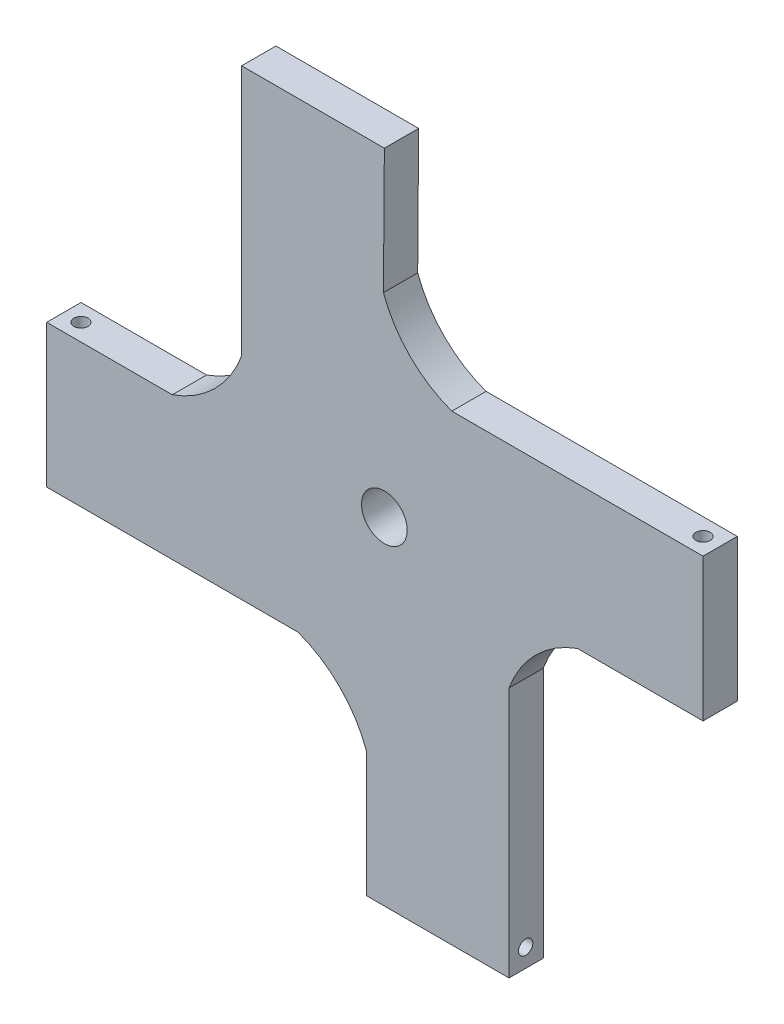
ISO-10303-21;
HEADER;
FILE_DESCRIPTION(('STEP AP214'),'2;1');
FILE_NAME('part.step','',(''),(''),'','','');
FILE_SCHEMA(('AUTOMOTIVE_DESIGN { 1 0 10303 214 1 1 1 1 }'));
ENDSEC;
DATA;
#1=APPLICATION_CONTEXT('core data for automotive mechanical design processes');
#2=APPLICATION_PROTOCOL_DEFINITION('international standard','automotive_design',2000,#1);
#3=PRODUCT_CONTEXT('',#1,'mechanical');
#4=PRODUCT('Part','Part','',(#3));
#5=PRODUCT_RELATED_PRODUCT_CATEGORY('part','',(#4));
#6=PRODUCT_DEFINITION_FORMATION('','',#4);
#7=PRODUCT_DEFINITION_CONTEXT('part definition',#1,'design');
#8=PRODUCT_DEFINITION('design','',#6,#7);
#9=PRODUCT_DEFINITION_SHAPE('','',#8);
#10=(LENGTH_UNIT() NAMED_UNIT(*) SI_UNIT(.MILLI.,.METRE.));
#11=(NAMED_UNIT(*) PLANE_ANGLE_UNIT() SI_UNIT($,.RADIAN.));
#12=(NAMED_UNIT(*) SI_UNIT($,.STERADIAN.) SOLID_ANGLE_UNIT());
#13=UNCERTAINTY_MEASURE_WITH_UNIT(LENGTH_MEASURE(1.E-05),#10,'distance_accuracy_value','');
#14=(GEOMETRIC_REPRESENTATION_CONTEXT(3) GLOBAL_UNCERTAINTY_ASSIGNED_CONTEXT((#13)) GLOBAL_UNIT_ASSIGNED_CONTEXT((#10,
#11,#12)) REPRESENTATION_CONTEXT('',''));
#15=CARTESIAN_POINT('',(0.,0.,0.));
#16=DIRECTION('',(0.,0.,1.));
#17=DIRECTION('',(1.,0.,0.));
#18=AXIS2_PLACEMENT_3D('',#15,#16,#17);
#19=CARTESIAN_POINT('',(-87.1613423245683,-13.7341731289876,6.));
#20=DIRECTION('',(0.,0.,-1.));
#21=DIRECTION('',(-1.,0.,0.));
#22=AXIS2_PLACEMENT_3D('',#19,#20,#21);
#23=CYLINDRICAL_SURFACE('',#22,20.);
#24=CARTESIAN_POINT('',(-87.1613423245683,-13.7341731289876,0.));
#25=DIRECTION('',(0.,0.,1.));
#26=DIRECTION('',(1.,0.,0.));
#27=AXIS2_PLACEMENT_3D('',#24,#25,#26);
#28=CIRCLE('',#27,20.);
#29=CARTESIAN_POINT('',(-80.5252849781846,-32.6011480559733,0.));
#30=VERTEX_POINT('',#29);
#31=CARTESIAN_POINT('',(-68.3848244538631,-20.6220157993082,0.));
#32=VERTEX_POINT('',#31);
#33=EDGE_CURVE('E179',#30,#32,#28,.T.);
#34=ORIENTED_EDGE('',*,*,#33,.F.);
#35=DIRECTION('',(0.,0.,-1.));
#36=VECTOR('',#35,1.);
#37=CARTESIAN_POINT('',(-80.5252849781846,-32.6011480559733,6.));
#38=LINE('',#37,#36);
#39=CARTESIAN_POINT('',(-80.5252849781846,-32.6011480559733,6.));
#40=VERTEX_POINT('',#39);
#41=EDGE_CURVE('E11',#40,#30,#38,.T.);
#42=ORIENTED_EDGE('',*,*,#41,.F.);
#43=CARTESIAN_POINT('',(-87.1613423245683,-13.7341731289876,6.));
#44=DIRECTION('',(0.,0.,1.));
#45=DIRECTION('',(1.,0.,0.));
#46=AXIS2_PLACEMENT_3D('',#43,#44,#45);
#47=CIRCLE('',#46,20.);
#48=CARTESIAN_POINT('',(-68.3848244538631,-20.6220157993082,6.));
#49=VERTEX_POINT('',#48);
#50=EDGE_CURVE('E223',#40,#49,#47,.T.);
#51=ORIENTED_EDGE('',*,*,#50,.T.);
#52=DIRECTION('',(0.,0.,-1.));
#53=VECTOR('',#52,1.);
#54=CARTESIAN_POINT('',(-68.3848244538631,-20.6220157993082,6.));
#55=LINE('',#54,#53);
#56=EDGE_CURVE('E109',#49,#32,#55,.T.);
#57=ORIENTED_EDGE('',*,*,#56,.T.);
#58=EDGE_LOOP('',(#34,#42,#51,#57));
#59=FACE_BOUND('',#58,.T.);
#60=ADVANCED_FACE('F35',(#59),#23,.F.);
#61=CARTESIAN_POINT('',(0.,-32.6011480559733,6.));
#62=DIRECTION('',(0.,1.,0.));
#63=DIRECTION('',(0.,0.,1.));
#64=AXIS2_PLACEMENT_3D('',#61,#62,#63);
#65=PLANE('',#64);
#66=CARTESIAN_POINT('',(-99.5252849781846,-32.6011480559733,3.));
#67=DIRECTION('',(0.,1.,0.));
#68=DIRECTION('',(0.,0.,1.));
#69=AXIS2_PLACEMENT_3D('',#66,#67,#68);
#70=CIRCLE('',#69,1.25);
#71=CARTESIAN_POINT('',(-99.5252849781846,-32.6011480559733,4.25));
#72=VERTEX_POINT('',#71);
#73=EDGE_CURVE('E319',#72,#72,#70,.T.);
#74=ORIENTED_EDGE('',*,*,#73,.F.);
#75=EDGE_LOOP('',(#74));
#76=FACE_BOUND('',#75,.T.);
#77=DIRECTION('',(1.,0.,0.));
#78=VECTOR('',#77,1.);
#79=CARTESIAN_POINT('',(0.,-32.6011480559733,0.));
#80=LINE('',#79,#78);
#81=CARTESIAN_POINT('',(-102.525284978185,-32.6011480559733,0.));
#82=VERTEX_POINT('',#81);
#83=EDGE_CURVE('E182',#82,#30,#80,.T.);
#84=ORIENTED_EDGE('',*,*,#83,.F.);
#85=DIRECTION('',(0.,0.,-1.));
#86=VECTOR('',#85,1.);
#87=CARTESIAN_POINT('',(-102.525284978185,-32.6011480559733,6.));
#88=LINE('',#87,#86);
#89=CARTESIAN_POINT('',(-102.525284978185,-32.6011480559733,6.));
#90=VERTEX_POINT('',#89);
#91=EDGE_CURVE('E43',#90,#82,#88,.T.);
#92=ORIENTED_EDGE('',*,*,#91,.F.);
#93=DIRECTION('',(1.,0.,0.));
#94=VECTOR('',#93,1.);
#95=CARTESIAN_POINT('',(0.,-32.6011480559733,6.));
#96=LINE('',#95,#94);
#97=EDGE_CURVE('E309',#90,#40,#96,.T.);
#98=ORIENTED_EDGE('',*,*,#97,.T.);
#99=ORIENTED_EDGE('',*,*,#41,.T.);
#100=EDGE_LOOP('',(#84,#92,#98,#99));
#101=FACE_BOUND('',#100,.T.);
#102=ADVANCED_FACE('F260',(#76,#101),#65,.T.);
#103=CARTESIAN_POINT('',(-102.525284978185,0.,6.));
#104=DIRECTION('',(-1.,0.,0.));
#105=DIRECTION('',(0.,0.,1.));
#106=AXIS2_PLACEMENT_3D('',#103,#104,#105);
#107=PLANE('',#106);
#108=DIRECTION('',(0.,1.,0.));
#109=VECTOR('',#108,1.);
#110=CARTESIAN_POINT('',(-102.525284978185,0.,0.));
#111=LINE('',#110,#109);
#112=CARTESIAN_POINT('',(-102.525284978185,-57.6011480559733,0.));
#113=VERTEX_POINT('',#112);
#114=EDGE_CURVE('E186',#113,#82,#111,.T.);
#115=ORIENTED_EDGE('',*,*,#114,.F.);
#116=DIRECTION('',(0.,0.,-1.));
#117=VECTOR('',#116,1.);
#118=CARTESIAN_POINT('',(-102.525284978185,-57.6011480559733,6.));
#119=LINE('',#118,#117);
#120=CARTESIAN_POINT('',(-102.525284978185,-57.6011480559733,6.));
#121=VERTEX_POINT('',#120);
#122=EDGE_CURVE('E249',#121,#113,#119,.T.);
#123=ORIENTED_EDGE('',*,*,#122,.F.);
#124=DIRECTION('',(0.,1.,0.));
#125=VECTOR('',#124,1.);
#126=CARTESIAN_POINT('',(-102.525284978185,0.,6.));
#127=LINE('',#126,#125);
#128=EDGE_CURVE('E256',#121,#90,#127,.T.);
#129=ORIENTED_EDGE('',*,*,#128,.T.);
#130=ORIENTED_EDGE('',*,*,#91,.T.);
#131=EDGE_LOOP('',(#115,#123,#129,#130));
#132=FACE_BOUND('',#131,.T.);
#133=ADVANCED_FACE('F254',(#132),#107,.T.);
#134=CARTESIAN_POINT('',(0.,-57.6011480559733,6.));
#135=DIRECTION('',(0.,1.,0.));
#136=DIRECTION('',(0.,0.,1.));
#137=AXIS2_PLACEMENT_3D('',#134,#135,#136);
#138=PLANE('',#137);
#139=CARTESIAN_POINT('',(-99.5252849781846,-57.6011480559733,3.));
#140=DIRECTION('',(0.,-1.,0.));
#141=DIRECTION('',(0.,0.,-1.));
#142=AXIS2_PLACEMENT_3D('',#139,#140,#141);
#143=CIRCLE('',#142,1.25);
#144=CARTESIAN_POINT('',(-99.5252849781846,-57.6011480559733,1.75));
#145=VERTEX_POINT('',#144);
#146=EDGE_CURVE('E313',#145,#145,#143,.T.);
#147=ORIENTED_EDGE('',*,*,#146,.F.);
#148=EDGE_LOOP('',(#147));
#149=FACE_BOUND('',#148,.T.);
#150=DIRECTION('',(1.,0.,0.));
#151=VECTOR('',#150,1.);
#152=CARTESIAN_POINT('',(0.,-57.6011480559733,0.));
#153=LINE('',#152,#151);
#154=CARTESIAN_POINT('',(-58.5252849781846,-57.6011480559733,0.));
#155=VERTEX_POINT('',#154);
#156=EDGE_CURVE('E189',#113,#155,#153,.T.);
#157=ORIENTED_EDGE('',*,*,#156,.T.);
#158=DIRECTION('',(0.,0.,-1.));
#159=VECTOR('',#158,1.);
#160=CARTESIAN_POINT('',(-58.5252849781846,-57.6011480559733,6.));
#161=LINE('',#160,#159);
#162=CARTESIAN_POINT('',(-58.5252849781846,-57.6011480559733,6.));
#163=VERTEX_POINT('',#162);
#164=EDGE_CURVE('E246',#163,#155,#161,.T.);
#165=ORIENTED_EDGE('',*,*,#164,.F.);
#166=DIRECTION('',(1.,0.,0.));
#167=VECTOR('',#166,1.);
#168=CARTESIAN_POINT('',(0.,-57.6011480559733,6.));
#169=LINE('',#168,#167);
#170=EDGE_CURVE('E278',#121,#163,#169,.T.);
#171=ORIENTED_EDGE('',*,*,#170,.F.);
#172=ORIENTED_EDGE('',*,*,#122,.T.);
#173=EDGE_LOOP('',(#157,#165,#171,#172));
#174=FACE_BOUND('',#173,.T.);
#175=ADVANCED_FACE('F268',(#149,#174),#138,.F.);
#176=CARTESIAN_POINT('',(-65.3464197432838,-76.4020023056173,6.));
#177=DIRECTION('',(0.,0.,-1.));
#178=DIRECTION('',(-1.,0.,0.));
#179=AXIS2_PLACEMENT_3D('',#176,#177,#178);
#180=CYLINDRICAL_SURFACE('',#179,20.);
#181=CARTESIAN_POINT('',(-65.3464197432838,-76.4020023056173,0.));
#182=DIRECTION('',(0.,0.,1.));
#183=DIRECTION('',(1.,0.,0.));
#184=AXIS2_PLACEMENT_3D('',#181,#182,#183);
#185=CIRCLE('',#184,20.);
#186=CARTESIAN_POINT('',(-46.5455654936399,-69.580867540518,0.));
#187=VERTEX_POINT('',#186);
#188=EDGE_CURVE('E191',#155,#187,#185,.F.);
#189=ORIENTED_EDGE('',*,*,#188,.T.);
#190=DIRECTION('',(0.,0.,-1.));
#191=VECTOR('',#190,1.);
#192=CARTESIAN_POINT('',(-46.5455654936399,-69.580867540518,6.));
#193=LINE('',#192,#191);
#194=CARTESIAN_POINT('',(-46.5455654936399,-69.580867540518,6.));
#195=VERTEX_POINT('',#194);
#196=EDGE_CURVE('E244',#195,#187,#193,.T.);
#197=ORIENTED_EDGE('',*,*,#196,.F.);
#198=CARTESIAN_POINT('',(-65.3464197432838,-76.4020023056173,6.));
#199=DIRECTION('',(0.,0.,1.));
#200=DIRECTION('',(1.,0.,0.));
#201=AXIS2_PLACEMENT_3D('',#198,#199,#200);
#202=CIRCLE('',#201,20.);
#203=EDGE_CURVE('E274',#163,#195,#202,.F.);
#204=ORIENTED_EDGE('',*,*,#203,.F.);
#205=ORIENTED_EDGE('',*,*,#164,.T.);
#206=EDGE_LOOP('',(#189,#197,#204,#205));
#207=FACE_BOUND('',#206,.T.);
#208=ADVANCED_FACE('F272',(#207),#180,.F.);
#209=CARTESIAN_POINT('',(-46.5455654936399,0.,6.));
#210=DIRECTION('',(-1.,0.,0.));
#211=DIRECTION('',(0.,-1.,0.));
#212=AXIS2_PLACEMENT_3D('',#209,#210,#211);
#213=PLANE('',#212);
#214=CARTESIAN_POINT('',(-46.5455654936399,-88.3478026647778,3.08764742241793));
#215=DIRECTION('',(-1.,0.,0.));
#216=DIRECTION('',(0.,-1.,0.));
#217=AXIS2_PLACEMENT_3D('',#214,#215,#216);
#218=CIRCLE('',#217,1.25);
#219=CARTESIAN_POINT('',(-46.5455654936399,-89.5978026647778,3.08764742241793));
#220=VERTEX_POINT('',#219);
#221=EDGE_CURVE('E331',#220,#220,#218,.T.);
#222=ORIENTED_EDGE('',*,*,#221,.F.);
#223=EDGE_LOOP('',(#222));
#224=FACE_BOUND('',#223,.T.);
#225=DIRECTION('',(0.,1.,0.));
#226=VECTOR('',#225,1.);
#227=CARTESIAN_POINT('',(-46.5455654936399,0.,0.));
#228=LINE('',#227,#226);
#229=CARTESIAN_POINT('',(-46.5455654936399,-91.580867540518,0.));
#230=VERTEX_POINT('',#229);
#231=EDGE_CURVE('E194',#230,#187,#228,.T.);
#232=ORIENTED_EDGE('',*,*,#231,.F.);
#233=DIRECTION('',(0.,0.,-1.));
#234=VECTOR('',#233,1.);
#235=CARTESIAN_POINT('',(-46.5455654936399,-91.580867540518,6.));
#236=LINE('',#235,#234);
#237=CARTESIAN_POINT('',(-46.5455654936399,-91.580867540518,6.));
#238=VERTEX_POINT('',#237);
#239=EDGE_CURVE('E242',#238,#230,#236,.T.);
#240=ORIENTED_EDGE('',*,*,#239,.F.);
#241=DIRECTION('',(0.,1.,0.));
#242=VECTOR('',#241,1.);
#243=CARTESIAN_POINT('',(-46.5455654936399,0.,6.));
#244=LINE('',#243,#242);
#245=EDGE_CURVE('E277',#238,#195,#244,.T.);
#246=ORIENTED_EDGE('',*,*,#245,.T.);
#247=ORIENTED_EDGE('',*,*,#196,.T.);
#248=EDGE_LOOP('',(#232,#240,#246,#247));
#249=FACE_BOUND('',#248,.T.);
#250=ADVANCED_FACE('F380',(#224,#249),#213,.T.);
#251=CARTESIAN_POINT('',(0.,-91.5808675405179,6.));
#252=DIRECTION('',(0.,1.,0.));
#253=DIRECTION('',(-1.,0.,0.));
#254=AXIS2_PLACEMENT_3D('',#251,#252,#253);
#255=PLANE('',#254);
#256=DIRECTION('',(1.,0.,0.));
#257=VECTOR('',#256,1.);
#258=CARTESIAN_POINT('',(0.,-91.5808675405179,0.));
#259=LINE('',#258,#257);
#260=CARTESIAN_POINT('',(-21.5455654936399,-91.5808675405179,0.));
#261=VERTEX_POINT('',#260);
#262=EDGE_CURVE('E197',#230,#261,#259,.T.);
#263=ORIENTED_EDGE('',*,*,#262,.T.);
#264=DIRECTION('',(0.,0.,-1.));
#265=VECTOR('',#264,1.);
#266=CARTESIAN_POINT('',(-21.5455654936399,-91.5808675405179,6.));
#267=LINE('',#266,#265);
#268=CARTESIAN_POINT('',(-21.5455654936399,-91.5808675405179,6.));
#269=VERTEX_POINT('',#268);
#270=EDGE_CURVE('E239',#269,#261,#267,.T.);
#271=ORIENTED_EDGE('',*,*,#270,.F.);
#272=DIRECTION('',(1.,0.,0.));
#273=VECTOR('',#272,1.);
#274=CARTESIAN_POINT('',(0.,-91.5808675405179,6.));
#275=LINE('',#274,#273);
#276=EDGE_CURVE('E280',#238,#269,#275,.T.);
#277=ORIENTED_EDGE('',*,*,#276,.F.);
#278=ORIENTED_EDGE('',*,*,#239,.T.);
#279=EDGE_LOOP('',(#263,#271,#277,#278));
#280=FACE_BOUND('',#279,.T.);
#281=ADVANCED_FACE('F382',(#280),#255,.F.);
#282=CARTESIAN_POINT('',(-21.5455654936399,0.,6.));
#283=DIRECTION('',(-1.,0.,0.));
#284=DIRECTION('',(0.,-1.,0.));
#285=AXIS2_PLACEMENT_3D('',#282,#283,#284);
#286=PLANE('',#285);
#287=CARTESIAN_POINT('',(-21.5455654936399,-88.3478026647778,3.08764742241793));
#288=DIRECTION('',(1.,0.,0.));
#289=DIRECTION('',(0.,1.,0.));
#290=AXIS2_PLACEMENT_3D('',#287,#288,#289);
#291=CIRCLE('',#290,1.25);
#292=CARTESIAN_POINT('',(-21.5455654936399,-87.0978026647778,3.08764742241793));
#293=VERTEX_POINT('',#292);
#294=EDGE_CURVE('E325',#293,#293,#291,.T.);
#295=ORIENTED_EDGE('',*,*,#294,.F.);
#296=EDGE_LOOP('',(#295));
#297=FACE_BOUND('',#296,.T.);
#298=DIRECTION('',(0.,1.,0.));
#299=VECTOR('',#298,1.);
#300=CARTESIAN_POINT('',(-21.5455654936399,0.,0.));
#301=LINE('',#300,#299);
#302=CARTESIAN_POINT('',(-21.5455654936399,-47.580867540518,0.));
#303=VERTEX_POINT('',#302);
#304=EDGE_CURVE('E199',#261,#303,#301,.T.);
#305=ORIENTED_EDGE('',*,*,#304,.T.);
#306=DIRECTION('',(0.,0.,-1.));
#307=VECTOR('',#306,1.);
#308=CARTESIAN_POINT('',(-21.5455654936399,-47.580867540518,6.));
#309=LINE('',#308,#307);
#310=CARTESIAN_POINT('',(-21.5455654936399,-47.580867540518,6.));
#311=VERTEX_POINT('',#310);
#312=EDGE_CURVE('E237',#311,#303,#309,.T.);
#313=ORIENTED_EDGE('',*,*,#312,.F.);
#314=DIRECTION('',(0.,1.,0.));
#315=VECTOR('',#314,1.);
#316=CARTESIAN_POINT('',(-21.5455654936399,0.,6.));
#317=LINE('',#316,#315);
#318=EDGE_CURVE('E286',#269,#311,#317,.T.);
#319=ORIENTED_EDGE('',*,*,#318,.F.);
#320=ORIENTED_EDGE('',*,*,#270,.T.);
#321=EDGE_LOOP('',(#305,#313,#319,#320));
#322=FACE_BOUND('',#321,.T.);
#323=ADVANCED_FACE('F374',(#297,#322),#286,.F.);
#324=CARTESIAN_POINT('',(-2.74471124399596,-54.4020023056172,6.));
#325=DIRECTION('',(0.,0.,-1.));
#326=DIRECTION('',(-1.,0.,0.));
#327=AXIS2_PLACEMENT_3D('',#324,#325,#326);
#328=CYLINDRICAL_SURFACE('',#327,20.);
#329=CARTESIAN_POINT('',(-2.74471124399596,-54.4020023056172,0.));
#330=DIRECTION('',(0.,0.,1.));
#331=DIRECTION('',(1.,0.,0.));
#332=AXIS2_PLACEMENT_3D('',#329,#330,#331);
#333=CIRCLE('',#332,20.);
#334=CARTESIAN_POINT('',(-9.56584600909524,-35.6011480559733,0.));
#335=VERTEX_POINT('',#334);
#336=EDGE_CURVE('E202',#335,#303,#333,.T.);
#337=ORIENTED_EDGE('',*,*,#336,.F.);
#338=DIRECTION('',(0.,0.,-1.));
#339=VECTOR('',#338,1.);
#340=CARTESIAN_POINT('',(-9.56584600909524,-35.6011480559733,6.));
#341=LINE('',#340,#339);
#342=CARTESIAN_POINT('',(-9.56584600909524,-35.6011480559733,6.));
#343=VERTEX_POINT('',#342);
#344=EDGE_CURVE('E235',#343,#335,#341,.T.);
#345=ORIENTED_EDGE('',*,*,#344,.F.);
#346=CARTESIAN_POINT('',(-2.74471124399596,-54.4020023056172,6.));
#347=DIRECTION('',(0.,0.,1.));
#348=DIRECTION('',(1.,0.,0.));
#349=AXIS2_PLACEMENT_3D('',#346,#347,#348);
#350=CIRCLE('',#349,20.);
#351=EDGE_CURVE('E288',#343,#311,#350,.T.);
#352=ORIENTED_EDGE('',*,*,#351,.T.);
#353=ORIENTED_EDGE('',*,*,#312,.T.);
#354=EDGE_LOOP('',(#337,#345,#352,#353));
#355=FACE_BOUND('',#354,.T.);
#356=ADVANCED_FACE('F362',(#355),#328,.F.);
#357=CARTESIAN_POINT('',(0.,-35.6011480559733,6.));
#358=DIRECTION('',(0.,-1.,0.));
#359=DIRECTION('',(1.,0.,0.));
#360=AXIS2_PLACEMENT_3D('',#357,#358,#359);
#361=PLANE('',#360);
#362=CARTESIAN_POINT('',(9.43415399090477,-35.6011480559733,3.));
#363=DIRECTION('',(0.,-1.,0.));
#364=DIRECTION('',(1.,0.,0.));
#365=AXIS2_PLACEMENT_3D('',#362,#363,#364);
#366=CIRCLE('',#365,1.25);
#367=CARTESIAN_POINT('',(10.6841539909048,-35.6011480559733,3.));
#368=VERTEX_POINT('',#367);
#369=EDGE_CURVE('E343',#368,#368,#366,.T.);
#370=ORIENTED_EDGE('',*,*,#369,.F.);
#371=EDGE_LOOP('',(#370));
#372=FACE_BOUND('',#371,.T.);
#373=DIRECTION('',(-1.,0.,0.));
#374=VECTOR('',#373,1.);
#375=CARTESIAN_POINT('',(0.,-35.6011480559733,0.));
#376=LINE('',#375,#374);
#377=CARTESIAN_POINT('',(12.4341539909048,-35.6011480559732,0.));
#378=VERTEX_POINT('',#377);
#379=EDGE_CURVE('E205',#378,#335,#376,.T.);
#380=ORIENTED_EDGE('',*,*,#379,.F.);
#381=DIRECTION('',(0.,0.,-1.));
#382=VECTOR('',#381,1.);
#383=CARTESIAN_POINT('',(12.4341539909048,-35.6011480559732,6.));
#384=LINE('',#383,#382);
#385=CARTESIAN_POINT('',(12.4341539909048,-35.6011480559732,6.));
#386=VERTEX_POINT('',#385);
#387=EDGE_CURVE('E233',#386,#378,#384,.T.);
#388=ORIENTED_EDGE('',*,*,#387,.F.);
#389=DIRECTION('',(-1.,0.,0.));
#390=VECTOR('',#389,1.);
#391=CARTESIAN_POINT('',(0.,-35.6011480559733,6.));
#392=LINE('',#391,#390);
#393=EDGE_CURVE('E291',#386,#343,#392,.T.);
#394=ORIENTED_EDGE('',*,*,#393,.T.);
#395=ORIENTED_EDGE('',*,*,#344,.T.);
#396=EDGE_LOOP('',(#380,#388,#394,#395));
#397=FACE_BOUND('',#396,.T.);
#398=ADVANCED_FACE('F358',(#372,#397),#361,.T.);
#399=CARTESIAN_POINT('',(12.4341539909048,0.,6.));
#400=DIRECTION('',(-1.,0.,0.));
#401=DIRECTION('',(0.,0.,1.));
#402=AXIS2_PLACEMENT_3D('',#399,#400,#401);
#403=PLANE('',#402);
#404=DIRECTION('',(0.,1.,0.));
#405=VECTOR('',#404,1.);
#406=CARTESIAN_POINT('',(12.4341539909048,0.,0.));
#407=LINE('',#406,#405);
#408=CARTESIAN_POINT('',(12.4341539909048,-10.6011480559732,0.));
#409=VERTEX_POINT('',#408);
#410=EDGE_CURVE('E208',#378,#409,#407,.T.);
#411=ORIENTED_EDGE('',*,*,#410,.T.);
#412=DIRECTION('',(0.,0.,-1.));
#413=VECTOR('',#412,1.);
#414=CARTESIAN_POINT('',(12.4341539909048,-10.6011480559732,6.));
#415=LINE('',#414,#413);
#416=CARTESIAN_POINT('',(12.4341539909048,-10.6011480559732,6.));
#417=VERTEX_POINT('',#416);
#418=EDGE_CURVE('E230',#417,#409,#415,.T.);
#419=ORIENTED_EDGE('',*,*,#418,.F.);
#420=DIRECTION('',(0.,1.,0.));
#421=VECTOR('',#420,1.);
#422=CARTESIAN_POINT('',(12.4341539909048,0.,6.));
#423=LINE('',#422,#421);
#424=EDGE_CURVE('E294',#386,#417,#423,.T.);
#425=ORIENTED_EDGE('',*,*,#424,.F.);
#426=ORIENTED_EDGE('',*,*,#387,.T.);
#427=EDGE_LOOP('',(#411,#419,#425,#426));
#428=FACE_BOUND('',#427,.T.);
#429=ADVANCED_FACE('F361',(#428),#403,.F.);
#430=CARTESIAN_POINT('',(0.,-10.6011480559732,6.));
#431=DIRECTION('',(0.,-1.,0.));
#432=DIRECTION('',(1.,0.,0.));
#433=AXIS2_PLACEMENT_3D('',#430,#431,#432);
#434=PLANE('',#433);
#435=CARTESIAN_POINT('',(9.43415399090475,-10.6011480559732,3.));
#436=DIRECTION('',(0.,1.,0.));
#437=DIRECTION('',(-1.,0.,0.));
#438=AXIS2_PLACEMENT_3D('',#435,#436,#437);
#439=CIRCLE('',#438,1.25);
#440=CARTESIAN_POINT('',(8.18415399090476,-10.6011480559732,3.));
#441=VERTEX_POINT('',#440);
#442=EDGE_CURVE('E337',#441,#441,#439,.T.);
#443=ORIENTED_EDGE('',*,*,#442,.F.);
#444=EDGE_LOOP('',(#443));
#445=FACE_BOUND('',#444,.T.);
#446=DIRECTION('',(-1.,0.,0.));
#447=VECTOR('',#446,1.);
#448=CARTESIAN_POINT('',(0.,-10.6011480559732,0.));
#449=LINE('',#448,#447);
#450=CARTESIAN_POINT('',(-31.5658460090952,-10.6011480559732,0.));
#451=VERTEX_POINT('',#450);
#452=EDGE_CURVE('E210',#409,#451,#449,.T.);
#453=ORIENTED_EDGE('',*,*,#452,.T.);
#454=DIRECTION('',(0.,0.,-1.));
#455=VECTOR('',#454,1.);
#456=CARTESIAN_POINT('',(-31.5658460090952,-10.6011480559732,6.));
#457=LINE('',#456,#455);
#458=CARTESIAN_POINT('',(-31.5658460090952,-10.6011480559732,6.));
#459=VERTEX_POINT('',#458);
#460=EDGE_CURVE('E227',#459,#451,#457,.T.);
#461=ORIENTED_EDGE('',*,*,#460,.F.);
#462=DIRECTION('',(-1.,0.,0.));
#463=VECTOR('',#462,1.);
#464=CARTESIAN_POINT('',(0.,-10.6011480559732,6.));
#465=LINE('',#464,#463);
#466=EDGE_CURVE('E296',#417,#459,#465,.T.);
#467=ORIENTED_EDGE('',*,*,#466,.F.);
#468=ORIENTED_EDGE('',*,*,#418,.T.);
#469=EDGE_LOOP('',(#453,#461,#467,#468));
#470=FACE_BOUND('',#469,.T.);
#471=ADVANCED_FACE('F303',(#445,#470),#434,.F.);
#472=CARTESIAN_POINT('',(-24.7447112439961,8.19970619367071,6.));
#473=DIRECTION('',(0.,0.,-1.));
#474=DIRECTION('',(-1.,0.,0.));
#475=AXIS2_PLACEMENT_3D('',#472,#473,#474);
#476=CYLINDRICAL_SURFACE('',#475,20.);
#477=CARTESIAN_POINT('',(-24.7447112439961,8.19970619367071,0.));
#478=DIRECTION('',(0.,0.,1.));
#479=DIRECTION('',(1.,0.,0.));
#480=AXIS2_PLACEMENT_3D('',#477,#478,#479);
#481=CIRCLE('',#480,20.);
#482=CARTESIAN_POINT('',(-43.54556549364,1.37857142857143,0.));
#483=VERTEX_POINT('',#482);
#484=EDGE_CURVE('E212',#451,#483,#481,.F.);
#485=ORIENTED_EDGE('',*,*,#484,.T.);
#486=DIRECTION('',(0.,0.,-1.));
#487=VECTOR('',#486,1.);
#488=CARTESIAN_POINT('',(-43.54556549364,1.37857142857143,6.));
#489=LINE('',#488,#487);
#490=CARTESIAN_POINT('',(-43.54556549364,1.37857142857143,6.));
#491=VERTEX_POINT('',#490);
#492=EDGE_CURVE('E162',#491,#483,#489,.T.);
#493=ORIENTED_EDGE('',*,*,#492,.F.);
#494=CARTESIAN_POINT('',(-24.7447112439961,8.19970619367071,6.));
#495=DIRECTION('',(0.,0.,1.));
#496=DIRECTION('',(1.,0.,0.));
#497=AXIS2_PLACEMENT_3D('',#494,#495,#496);
#498=CIRCLE('',#497,20.);
#499=EDGE_CURVE('E168',#459,#491,#498,.F.);
#500=ORIENTED_EDGE('',*,*,#499,.F.);
#501=ORIENTED_EDGE('',*,*,#460,.T.);
#502=EDGE_LOOP('',(#485,#493,#500,#501));
#503=FACE_BOUND('',#502,.T.);
#504=ADVANCED_FACE('F307',(#503),#476,.F.);
#505=CARTESIAN_POINT('',(-43.5533130132945,0.318226895054054,6.));
#506=DIRECTION('',(0.999973307823652,-0.00730641089894856,0.));
#507=DIRECTION('',(0.00730641089894856,0.999973307823652,0.));
#508=AXIS2_PLACEMENT_3D('',#505,#506,#507);
#509=PLANE('',#508);
#510=DIRECTION('',(-0.00730641089894856,-0.999973307823652,0.));
#511=VECTOR('',#510,1.);
#512=CARTESIAN_POINT('',(-43.5533130132945,0.318226895054054,0.));
#513=LINE('',#512,#511);
#514=CARTESIAN_POINT('',(-43.3848244538631,23.3779842006918,0.));
#515=VERTEX_POINT('',#514);
#516=EDGE_CURVE('E157',#515,#483,#513,.T.);
#517=ORIENTED_EDGE('',*,*,#516,.F.);
#518=DIRECTION('',(0.,0.,-1.));
#519=VECTOR('',#518,1.);
#520=CARTESIAN_POINT('',(-43.3848244538631,23.3779842006918,6.));
#521=LINE('',#520,#519);
#522=CARTESIAN_POINT('',(-43.3848244538631,23.3779842006918,6.));
#523=VERTEX_POINT('',#522);
#524=EDGE_CURVE('E152',#523,#515,#521,.T.);
#525=ORIENTED_EDGE('',*,*,#524,.F.);
#526=DIRECTION('',(-0.00730641089894856,-0.999973307823652,0.));
#527=VECTOR('',#526,1.);
#528=CARTESIAN_POINT('',(-43.5533130132945,0.318226895054054,6.));
#529=LINE('',#528,#527);
#530=EDGE_CURVE('E155',#523,#491,#529,.T.);
#531=ORIENTED_EDGE('',*,*,#530,.T.);
#532=ORIENTED_EDGE('',*,*,#492,.T.);
#533=EDGE_LOOP('',(#517,#525,#531,#532));
#534=FACE_BOUND('',#533,.T.);
#535=ADVANCED_FACE('F154',(#534),#509,.T.);
#536=CARTESIAN_POINT('',(0.,23.3779842006918,6.));
#537=DIRECTION('',(0.,1.,0.));
#538=DIRECTION('',(-1.,0.,0.));
#539=AXIS2_PLACEMENT_3D('',#536,#537,#538);
#540=PLANE('',#539);
#541=DIRECTION('',(1.,0.,0.));
#542=VECTOR('',#541,1.);
#543=CARTESIAN_POINT('',(0.,23.3779842006918,0.));
#544=LINE('',#543,#542);
#545=CARTESIAN_POINT('',(-68.3848244538631,23.3779842006918,0.));
#546=VERTEX_POINT('',#545);
#547=EDGE_CURVE('E216',#546,#515,#544,.T.);
#548=ORIENTED_EDGE('',*,*,#547,.F.);
#549=DIRECTION('',(0.,0.,-1.));
#550=VECTOR('',#549,1.);
#551=CARTESIAN_POINT('',(-68.3848244538631,23.3779842006918,6.));
#552=LINE('',#551,#550);
#553=CARTESIAN_POINT('',(-68.3848244538631,23.3779842006918,6.));
#554=VERTEX_POINT('',#553);
#555=EDGE_CURVE('E102',#554,#546,#552,.T.);
#556=ORIENTED_EDGE('',*,*,#555,.F.);
#557=DIRECTION('',(1.,0.,0.));
#558=VECTOR('',#557,1.);
#559=CARTESIAN_POINT('',(0.,23.3779842006918,6.));
#560=LINE('',#559,#558);
#561=EDGE_CURVE('E166',#554,#523,#560,.T.);
#562=ORIENTED_EDGE('',*,*,#561,.T.);
#563=ORIENTED_EDGE('',*,*,#524,.T.);
#564=EDGE_LOOP('',(#548,#556,#562,#563));
#565=FACE_BOUND('',#564,.T.);
#566=ADVANCED_FACE('F171',(#565),#540,.T.);
#567=CARTESIAN_POINT('',(-68.3848244538631,0.,6.));
#568=DIRECTION('',(1.,0.,0.));
#569=DIRECTION('',(0.,0.,-1.));
#570=AXIS2_PLACEMENT_3D('',#567,#568,#569);
#571=PLANE('',#570);
#572=DIRECTION('',(0.,-1.,0.));
#573=VECTOR('',#572,1.);
#574=CARTESIAN_POINT('',(-68.3848244538631,0.,0.));
#575=LINE('',#574,#573);
#576=EDGE_CURVE('E218',#546,#32,#575,.T.);
#577=ORIENTED_EDGE('',*,*,#576,.T.);
#578=ORIENTED_EDGE('',*,*,#56,.F.);
#579=DIRECTION('',(0.,-1.,0.));
#580=VECTOR('',#579,1.);
#581=CARTESIAN_POINT('',(-68.3848244538631,0.,6.));
#582=LINE('',#581,#580);
#583=EDGE_CURVE('E51',#554,#49,#582,.T.);
#584=ORIENTED_EDGE('',*,*,#583,.F.);
#585=ORIENTED_EDGE('',*,*,#555,.T.);
#586=EDGE_LOOP('',(#577,#578,#584,#585));
#587=FACE_BOUND('',#586,.T.);
#588=ADVANCED_FACE('F308',(#587),#571,.F.);
#589=CARTESIAN_POINT('',(-43.3848244538631,-32.6011480559733,6.));
#590=DIRECTION('',(0.,0.,-1.));
#591=DIRECTION('',(-1.,0.,0.));
#592=AXIS2_PLACEMENT_3D('',#589,#590,#591);
#593=CYLINDRICAL_SURFACE('',#592,4.00000000000001);
#594=CARTESIAN_POINT('',(-43.3848244538631,-32.6011480559733,6.));
#595=DIRECTION('',(0.,0.,1.));
#596=DIRECTION('',(1.,0.,0.));
#597=AXIS2_PLACEMENT_3D('',#594,#595,#596);
#598=CIRCLE('',#597,4.00000000000001);
#599=CARTESIAN_POINT('',(-39.3848244538631,-32.6011480559733,6.));
#600=VERTEX_POINT('',#599);
#601=EDGE_CURVE('E173',#600,#600,#598,.T.);
#602=ORIENTED_EDGE('',*,*,#601,.T.);
#603=EDGE_LOOP('',(#602));
#604=FACE_BOUND('',#603,.T.);
#605=CARTESIAN_POINT('',(-43.3848244538631,-32.6011480559733,0.));
#606=DIRECTION('',(0.,0.,1.));
#607=DIRECTION('',(1.,0.,0.));
#608=AXIS2_PLACEMENT_3D('',#605,#606,#607);
#609=CIRCLE('',#608,4.00000000000001);
#610=CARTESIAN_POINT('',(-39.3848244538631,-32.6011480559733,0.));
#611=VERTEX_POINT('',#610);
#612=EDGE_CURVE('E220',#611,#611,#609,.T.);
#613=ORIENTED_EDGE('',*,*,#612,.F.);
#614=EDGE_LOOP('',(#613));
#615=FACE_BOUND('',#614,.T.);
#616=ADVANCED_FACE('F527',(#604,#615),#593,.F.);
#617=CARTESIAN_POINT('',(0.,0.,6.));
#618=DIRECTION('',(0.,0.,1.));
#619=DIRECTION('',(1.,0.,0.));
#620=AXIS2_PLACEMENT_3D('',#617,#618,#619);
#621=PLANE('',#620);
#622=ORIENTED_EDGE('',*,*,#50,.F.);
#623=ORIENTED_EDGE('',*,*,#97,.F.);
#624=ORIENTED_EDGE('',*,*,#128,.F.);
#625=ORIENTED_EDGE('',*,*,#170,.T.);
#626=ORIENTED_EDGE('',*,*,#203,.T.);
#627=ORIENTED_EDGE('',*,*,#245,.F.);
#628=ORIENTED_EDGE('',*,*,#276,.T.);
#629=ORIENTED_EDGE('',*,*,#318,.T.);
#630=ORIENTED_EDGE('',*,*,#351,.F.);
#631=ORIENTED_EDGE('',*,*,#393,.F.);
#632=ORIENTED_EDGE('',*,*,#424,.T.);
#633=ORIENTED_EDGE('',*,*,#466,.T.);
#634=ORIENTED_EDGE('',*,*,#499,.T.);
#635=ORIENTED_EDGE('',*,*,#530,.F.);
#636=ORIENTED_EDGE('',*,*,#561,.F.);
#637=ORIENTED_EDGE('',*,*,#583,.T.);
#638=EDGE_LOOP('',(#622,#623,#624,#625,#626,#627,#628,#629,#630,#631,#632,#633,#634,#635,#636,#637));
#639=FACE_BOUND('',#638,.T.);
#640=ORIENTED_EDGE('',*,*,#601,.F.);
#641=EDGE_LOOP('',(#640));
#642=FACE_BOUND('',#641,.T.);
#643=ADVANCED_FACE('F164',(#639,#642),#621,.T.);
#644=CARTESIAN_POINT('',(0.,0.,0.));
#645=DIRECTION('',(0.,0.,1.));
#646=DIRECTION('',(1.,0.,0.));
#647=AXIS2_PLACEMENT_3D('',#644,#645,#646);
#648=PLANE('',#647);
#649=ORIENTED_EDGE('',*,*,#33,.T.);
#650=ORIENTED_EDGE('',*,*,#576,.F.);
#651=ORIENTED_EDGE('',*,*,#547,.T.);
#652=ORIENTED_EDGE('',*,*,#516,.T.);
#653=ORIENTED_EDGE('',*,*,#484,.F.);
#654=ORIENTED_EDGE('',*,*,#452,.F.);
#655=ORIENTED_EDGE('',*,*,#410,.F.);
#656=ORIENTED_EDGE('',*,*,#379,.T.);
#657=ORIENTED_EDGE('',*,*,#336,.T.);
#658=ORIENTED_EDGE('',*,*,#304,.F.);
#659=ORIENTED_EDGE('',*,*,#262,.F.);
#660=ORIENTED_EDGE('',*,*,#231,.T.);
#661=ORIENTED_EDGE('',*,*,#188,.F.);
#662=ORIENTED_EDGE('',*,*,#156,.F.);
#663=ORIENTED_EDGE('',*,*,#114,.T.);
#664=ORIENTED_EDGE('',*,*,#83,.T.);
#665=EDGE_LOOP('',(#649,#650,#651,#652,#653,#654,#655,#656,#657,#658,#659,#660,#661,#662,#663,#664));
#666=FACE_BOUND('',#665,.T.);
#667=ORIENTED_EDGE('',*,*,#612,.T.);
#668=EDGE_LOOP('',(#667));
#669=FACE_BOUND('',#668,.T.);
#670=ADVANCED_FACE('F263',(#666,#669),#648,.F.);
#671=CARTESIAN_POINT('',(-99.5252849781846,-52.6011480559733,3.));
#672=DIRECTION('',(0.,-1.,0.));
#673=DIRECTION('',(0.,0.,-1.));
#674=AXIS2_PLACEMENT_3D('',#671,#672,#673);
#675=CYLINDRICAL_SURFACE('',#674,1.25);
#676=CARTESIAN_POINT('',(-99.5252849781846,-52.6011480559733,3.));
#677=DIRECTION('',(0.,-1.,0.));
#678=DIRECTION('',(0.,0.,-1.));
#679=AXIS2_PLACEMENT_3D('',#676,#677,#678);
#680=CIRCLE('',#679,1.25);
#681=CARTESIAN_POINT('',(-99.5252849781846,-52.6011480559733,1.75));
#682=VERTEX_POINT('',#681);
#683=EDGE_CURVE('E183',#682,#682,#680,.T.);
#684=ORIENTED_EDGE('',*,*,#683,.F.);
#685=EDGE_LOOP('',(#684));
#686=FACE_BOUND('',#685,.T.);
#687=ORIENTED_EDGE('',*,*,#146,.T.);
#688=EDGE_LOOP('',(#687));
#689=FACE_BOUND('',#688,.T.);
#690=ADVANCED_FACE('F520',(#686,#689),#675,.F.);
#691=CARTESIAN_POINT('',(-99.5252849781846,-52.6011480559733,3.));
#692=DIRECTION('',(0.,-1.,0.));
#693=DIRECTION('',(0.,0.,-1.));
#694=AXIS2_PLACEMENT_3D('',#691,#692,#693);
#695=PLANE('',#694);
#696=ORIENTED_EDGE('',*,*,#683,.T.);
#697=EDGE_LOOP('',(#696));
#698=FACE_BOUND('',#697,.T.);
#699=ADVANCED_FACE('F516',(#698),#695,.T.);
#700=CARTESIAN_POINT('',(-99.5252849781846,-37.6011480559733,3.));
#701=DIRECTION('',(0.,1.,0.));
#702=DIRECTION('',(0.,0.,1.));
#703=AXIS2_PLACEMENT_3D('',#700,#701,#702);
#704=CYLINDRICAL_SURFACE('',#703,1.25);
#705=CARTESIAN_POINT('',(-99.5252849781846,-37.6011480559733,3.));
#706=DIRECTION('',(0.,1.,0.));
#707=DIRECTION('',(0.,0.,1.));
#708=AXIS2_PLACEMENT_3D('',#705,#706,#707);
#709=CIRCLE('',#708,1.25);
#710=CARTESIAN_POINT('',(-99.5252849781846,-37.6011480559733,4.25));
#711=VERTEX_POINT('',#710);
#712=EDGE_CURVE('E316',#711,#711,#709,.T.);
#713=ORIENTED_EDGE('',*,*,#712,.F.);
#714=EDGE_LOOP('',(#713));
#715=FACE_BOUND('',#714,.T.);
#716=ORIENTED_EDGE('',*,*,#73,.T.);
#717=EDGE_LOOP('',(#716));
#718=FACE_BOUND('',#717,.T.);
#719=ADVANCED_FACE('F512',(#715,#718),#704,.F.);
#720=CARTESIAN_POINT('',(-99.5252849781846,-37.6011480559733,3.));
#721=DIRECTION('',(0.,1.,0.));
#722=DIRECTION('',(0.,0.,1.));
#723=AXIS2_PLACEMENT_3D('',#720,#721,#722);
#724=PLANE('',#723);
#725=ORIENTED_EDGE('',*,*,#712,.T.);
#726=EDGE_LOOP('',(#725));
#727=FACE_BOUND('',#726,.T.);
#728=ADVANCED_FACE('F508',(#727),#724,.T.);
#729=CARTESIAN_POINT('',(-26.5455654936399,-88.3478026647778,3.08764742241793));
#730=DIRECTION('',(1.,0.,0.));
#731=DIRECTION('',(0.,1.,0.));
#732=AXIS2_PLACEMENT_3D('',#729,#730,#731);
#733=CYLINDRICAL_SURFACE('',#732,1.25);
#734=CARTESIAN_POINT('',(-26.5455654936399,-88.3478026647778,3.08764742241793));
#735=DIRECTION('',(1.,0.,0.));
#736=DIRECTION('',(0.,1.,0.));
#737=AXIS2_PLACEMENT_3D('',#734,#735,#736);
#738=CIRCLE('',#737,1.25);
#739=CARTESIAN_POINT('',(-26.5455654936399,-87.0978026647778,3.08764742241793));
#740=VERTEX_POINT('',#739);
#741=EDGE_CURVE('E322',#740,#740,#738,.T.);
#742=ORIENTED_EDGE('',*,*,#741,.F.);
#743=EDGE_LOOP('',(#742));
#744=FACE_BOUND('',#743,.T.);
#745=ORIENTED_EDGE('',*,*,#294,.T.);
#746=EDGE_LOOP('',(#745));
#747=FACE_BOUND('',#746,.T.);
#748=ADVANCED_FACE('F504',(#744,#747),#733,.F.);
#749=CARTESIAN_POINT('',(-26.5455654936399,-88.3478026647778,3.08764742241793));
#750=DIRECTION('',(1.,0.,0.));
#751=DIRECTION('',(0.,1.,0.));
#752=AXIS2_PLACEMENT_3D('',#749,#750,#751);
#753=PLANE('',#752);
#754=ORIENTED_EDGE('',*,*,#741,.T.);
#755=EDGE_LOOP('',(#754));
#756=FACE_BOUND('',#755,.T.);
#757=ADVANCED_FACE('F424',(#756),#753,.T.);
#758=CARTESIAN_POINT('',(-41.5455654936399,-88.3478026647778,3.08764742241793));
#759=DIRECTION('',(-1.,0.,0.));
#760=DIRECTION('',(0.,-1.,0.));
#761=AXIS2_PLACEMENT_3D('',#758,#759,#760);
#762=CYLINDRICAL_SURFACE('',#761,1.25);
#763=CARTESIAN_POINT('',(-41.5455654936399,-88.3478026647778,3.08764742241793));
#764=DIRECTION('',(-1.,0.,0.));
#765=DIRECTION('',(0.,-1.,0.));
#766=AXIS2_PLACEMENT_3D('',#763,#764,#765);
#767=CIRCLE('',#766,1.25);
#768=CARTESIAN_POINT('',(-41.5455654936399,-89.5978026647778,3.08764742241793));
#769=VERTEX_POINT('',#768);
#770=EDGE_CURVE('E328',#769,#769,#767,.T.);
#771=ORIENTED_EDGE('',*,*,#770,.F.);
#772=EDGE_LOOP('',(#771));
#773=FACE_BOUND('',#772,.T.);
#774=ORIENTED_EDGE('',*,*,#221,.T.);
#775=EDGE_LOOP('',(#774));
#776=FACE_BOUND('',#775,.T.);
#777=ADVANCED_FACE('F429',(#773,#776),#762,.F.);
#778=CARTESIAN_POINT('',(-41.5455654936399,-88.3478026647778,3.08764742241793));
#779=DIRECTION('',(-1.,0.,0.));
#780=DIRECTION('',(0.,-1.,0.));
#781=AXIS2_PLACEMENT_3D('',#778,#779,#780);
#782=PLANE('',#781);
#783=ORIENTED_EDGE('',*,*,#770,.T.);
#784=EDGE_LOOP('',(#783));
#785=FACE_BOUND('',#784,.T.);
#786=ADVANCED_FACE('F434',(#785),#782,.T.);
#787=CARTESIAN_POINT('',(9.43415399090475,-15.6011480559732,3.));
#788=DIRECTION('',(0.,1.,0.));
#789=DIRECTION('',(-1.,0.,0.));
#790=AXIS2_PLACEMENT_3D('',#787,#788,#789);
#791=CYLINDRICAL_SURFACE('',#790,1.25);
#792=CARTESIAN_POINT('',(9.43415399090475,-15.6011480559732,3.));
#793=DIRECTION('',(0.,1.,0.));
#794=DIRECTION('',(-1.,0.,0.));
#795=AXIS2_PLACEMENT_3D('',#792,#793,#794);
#796=CIRCLE('',#795,1.25);
#797=CARTESIAN_POINT('',(8.18415399090476,-15.6011480559732,3.));
#798=VERTEX_POINT('',#797);
#799=EDGE_CURVE('E334',#798,#798,#796,.T.);
#800=ORIENTED_EDGE('',*,*,#799,.F.);
#801=EDGE_LOOP('',(#800));
#802=FACE_BOUND('',#801,.T.);
#803=ORIENTED_EDGE('',*,*,#442,.T.);
#804=EDGE_LOOP('',(#803));
#805=FACE_BOUND('',#804,.T.);
#806=ADVANCED_FACE('F444',(#802,#805),#791,.F.);
#807=CARTESIAN_POINT('',(9.43415399090475,-15.6011480559732,3.));
#808=DIRECTION('',(0.,1.,0.));
#809=DIRECTION('',(-1.,0.,0.));
#810=AXIS2_PLACEMENT_3D('',#807,#808,#809);
#811=PLANE('',#810);
#812=ORIENTED_EDGE('',*,*,#799,.T.);
#813=EDGE_LOOP('',(#812));
#814=FACE_BOUND('',#813,.T.);
#815=ADVANCED_FACE('F354',(#814),#811,.T.);
#816=CARTESIAN_POINT('',(9.43415399090477,-30.6011480559733,3.));
#817=DIRECTION('',(0.,-1.,0.));
#818=DIRECTION('',(1.,0.,0.));
#819=AXIS2_PLACEMENT_3D('',#816,#817,#818);
#820=CYLINDRICAL_SURFACE('',#819,1.25);
#821=CARTESIAN_POINT('',(9.43415399090477,-30.6011480559733,3.));
#822=DIRECTION('',(0.,-1.,0.));
#823=DIRECTION('',(1.,0.,0.));
#824=AXIS2_PLACEMENT_3D('',#821,#822,#823);
#825=CIRCLE('',#824,1.25);
#826=CARTESIAN_POINT('',(10.6841539909048,-30.6011480559733,3.));
#827=VERTEX_POINT('',#826);
#828=EDGE_CURVE('E340',#827,#827,#825,.T.);
#829=ORIENTED_EDGE('',*,*,#828,.F.);
#830=EDGE_LOOP('',(#829));
#831=FACE_BOUND('',#830,.T.);
#832=ORIENTED_EDGE('',*,*,#369,.T.);
#833=EDGE_LOOP('',(#832));
#834=FACE_BOUND('',#833,.T.);
#835=ADVANCED_FACE('F351',(#831,#834),#820,.F.);
#836=CARTESIAN_POINT('',(9.43415399090477,-30.6011480559733,3.));
#837=DIRECTION('',(0.,-1.,0.));
#838=DIRECTION('',(1.,0.,0.));
#839=AXIS2_PLACEMENT_3D('',#836,#837,#838);
#840=PLANE('',#839);
#841=ORIENTED_EDGE('',*,*,#828,.T.);
#842=EDGE_LOOP('',(#841));
#843=FACE_BOUND('',#842,.T.);
#844=ADVANCED_FACE('F349',(#843),#840,.T.);
#845=CLOSED_SHELL('',(#60,#102,#133,#175,#208,#250,#281,#323,#356,#398,#429,#471,#504,#535,#566,
#588,#616,#643,#670,#690,#699,#719,#728,#748,#757,#777,#786,#806,#815,#835,#844));
#846=MANIFOLD_SOLID_BREP('B2',#845);
#847=ADVANCED_BREP_SHAPE_REPRESENTATION('',(#18,#846),#14);
#848=SHAPE_DEFINITION_REPRESENTATION(#9,#847);
ENDSEC;
END-ISO-10303-21;
